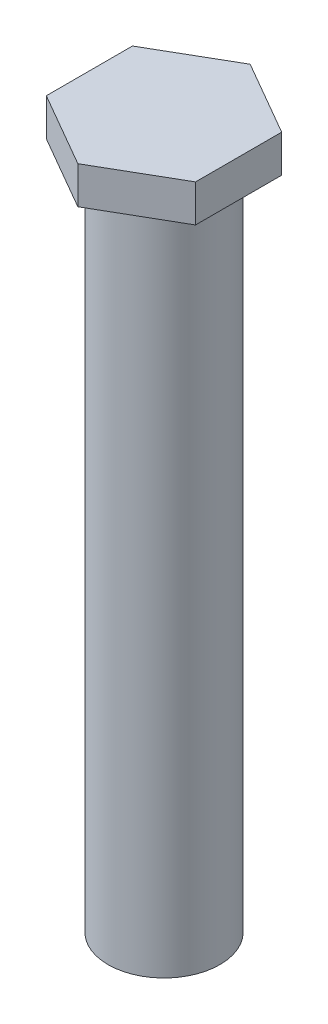
ISO-10303-21;
HEADER;
FILE_DESCRIPTION(('STEP AP214'),'2;1');
FILE_NAME('part.step','',(''),(''),'','','');
FILE_SCHEMA(('AUTOMOTIVE_DESIGN { 1 0 10303 214 1 1 1 1 }'));
ENDSEC;
DATA;
#1=APPLICATION_CONTEXT('core data for automotive mechanical design processes');
#2=APPLICATION_PROTOCOL_DEFINITION('international standard','automotive_design',2000,#1);
#3=PRODUCT_CONTEXT('',#1,'mechanical');
#4=PRODUCT('Part','Part','',(#3));
#5=PRODUCT_RELATED_PRODUCT_CATEGORY('part','',(#4));
#6=PRODUCT_DEFINITION_FORMATION('','',#4);
#7=PRODUCT_DEFINITION_CONTEXT('part definition',#1,'design');
#8=PRODUCT_DEFINITION('design','',#6,#7);
#9=PRODUCT_DEFINITION_SHAPE('','',#8);
#10=(LENGTH_UNIT() NAMED_UNIT(*) SI_UNIT(.MILLI.,.METRE.));
#11=(NAMED_UNIT(*) PLANE_ANGLE_UNIT() SI_UNIT($,.RADIAN.));
#12=(NAMED_UNIT(*) SI_UNIT($,.STERADIAN.) SOLID_ANGLE_UNIT());
#13=UNCERTAINTY_MEASURE_WITH_UNIT(LENGTH_MEASURE(1.E-05),#10,'distance_accuracy_value','');
#14=(GEOMETRIC_REPRESENTATION_CONTEXT(3) GLOBAL_UNCERTAINTY_ASSIGNED_CONTEXT((#13)) GLOBAL_UNIT_ASSIGNED_CONTEXT((#10,
#11,#12)) REPRESENTATION_CONTEXT('',''));
#15=CARTESIAN_POINT('',(0.,0.,0.));
#16=DIRECTION('',(0.,0.,1.));
#17=DIRECTION('',(1.,0.,0.));
#18=AXIS2_PLACEMENT_3D('',#15,#16,#17);
#19=CARTESIAN_POINT('',(0.,114.3,0.));
#20=DIRECTION('',(0.,-1.,0.));
#21=DIRECTION('',(0.,0.,-1.));
#22=AXIS2_PLACEMENT_3D('',#19,#20,#21);
#23=CYLINDRICAL_SURFACE('',#22,9.525);
#24=CARTESIAN_POINT('',(0.,114.3,0.));
#25=DIRECTION('',(0.,1.,0.));
#26=DIRECTION('',(0.,0.,1.));
#27=AXIS2_PLACEMENT_3D('',#24,#25,#26);
#28=CIRCLE('',#27,9.525);
#29=CARTESIAN_POINT('',(0.,114.3,9.525));
#30=VERTEX_POINT('',#29);
#31=EDGE_CURVE('E11',#30,#30,#28,.T.);
#32=ORIENTED_EDGE('',*,*,#31,.F.);
#33=EDGE_LOOP('',(#32));
#34=FACE_BOUND('',#33,.T.);
#35=CARTESIAN_POINT('',(0.,0.,0.));
#36=DIRECTION('',(0.,1.,0.));
#37=DIRECTION('',(0.,0.,1.));
#38=AXIS2_PLACEMENT_3D('',#35,#36,#37);
#39=CIRCLE('',#38,9.525);
#40=CARTESIAN_POINT('',(0.,0.,9.525));
#41=VERTEX_POINT('',#40);
#42=EDGE_CURVE('E35',#41,#41,#39,.T.);
#43=ORIENTED_EDGE('',*,*,#42,.T.);
#44=EDGE_LOOP('',(#43));
#45=FACE_BOUND('',#44,.T.);
#46=ADVANCED_FACE('F32',(#34,#45),#23,.T.);
#47=CARTESIAN_POINT('',(0.,0.,0.));
#48=DIRECTION('',(0.,1.,0.));
#49=DIRECTION('',(0.,0.,1.));
#50=AXIS2_PLACEMENT_3D('',#47,#48,#49);
#51=PLANE('',#50);
#52=ORIENTED_EDGE('',*,*,#42,.F.);
#53=EDGE_LOOP('',(#52));
#54=FACE_BOUND('',#53,.T.);
#55=ADVANCED_FACE('F140',(#54),#51,.F.);
#56=CARTESIAN_POINT('',(0.,114.3,0.));
#57=DIRECTION('',(0.,1.,0.));
#58=DIRECTION('',(0.,0.,1.));
#59=AXIS2_PLACEMENT_3D('',#56,#57,#58);
#60=PLANE('',#59);
#61=DIRECTION('',(0.,0.,-1.));
#62=VECTOR('',#61,1.);
#63=CARTESIAN_POINT('',(12.7,114.3,7.33234841870825));
#64=LINE('',#63,#62);
#65=CARTESIAN_POINT('',(12.7,114.3,7.33234841870825));
#66=VERTEX_POINT('',#65);
#67=CARTESIAN_POINT('',(12.7,114.3,-7.33234841870825));
#68=VERTEX_POINT('',#67);
#69=EDGE_CURVE('E117',#66,#68,#64,.T.);
#70=ORIENTED_EDGE('',*,*,#69,.F.);
#71=DIRECTION('',(0.866025403784439,0.,-0.5));
#72=VECTOR('',#71,1.);
#73=CARTESIAN_POINT('',(0.,114.3,14.6646968374165));
#74=LINE('',#73,#72);
#75=CARTESIAN_POINT('',(0.,114.3,14.6646968374165));
#76=VERTEX_POINT('',#75);
#77=EDGE_CURVE('E77',#76,#66,#74,.T.);
#78=ORIENTED_EDGE('',*,*,#77,.F.);
#79=DIRECTION('',(0.866025403784439,0.,0.5));
#80=VECTOR('',#79,1.);
#81=CARTESIAN_POINT('',(-12.7,114.3,7.33234841870824));
#82=LINE('',#81,#80);
#83=CARTESIAN_POINT('',(-12.7,114.3,7.33234841870824));
#84=VERTEX_POINT('',#83);
#85=EDGE_CURVE('E71',#84,#76,#82,.T.);
#86=ORIENTED_EDGE('',*,*,#85,.F.);
#87=DIRECTION('',(0.,0.,1.));
#88=VECTOR('',#87,1.);
#89=CARTESIAN_POINT('',(-12.7,114.3,-7.33234841870825));
#90=LINE('',#89,#88);
#91=CARTESIAN_POINT('',(-12.7,114.3,-7.33234841870825));
#92=VERTEX_POINT('',#91);
#93=EDGE_CURVE('E107',#92,#84,#90,.T.);
#94=ORIENTED_EDGE('',*,*,#93,.F.);
#95=DIRECTION('',(-0.866025403784439,0.,0.5));
#96=VECTOR('',#95,1.);
#97=CARTESIAN_POINT('',(0.,114.3,-14.6646968374165));
#98=LINE('',#97,#96);
#99=CARTESIAN_POINT('',(0.,114.3,-14.6646968374165));
#100=VERTEX_POINT('',#99);
#101=EDGE_CURVE('E122',#100,#92,#98,.T.);
#102=ORIENTED_EDGE('',*,*,#101,.F.);
#103=DIRECTION('',(-0.866025403784439,0.,-0.5));
#104=VECTOR('',#103,1.);
#105=CARTESIAN_POINT('',(12.7,114.3,-7.33234841870825));
#106=LINE('',#105,#104);
#107=EDGE_CURVE('E120',#68,#100,#106,.T.);
#108=ORIENTED_EDGE('',*,*,#107,.F.);
#109=EDGE_LOOP('',(#70,#78,#86,#94,#102,#108));
#110=FACE_BOUND('',#109,.T.);
#111=ORIENTED_EDGE('',*,*,#31,.T.);
#112=EDGE_LOOP('',(#111));
#113=FACE_BOUND('',#112,.T.);
#114=ADVANCED_FACE('F142',(#110,#113),#60,.F.);
#115=CARTESIAN_POINT('',(12.7,120.65,7.33234841870825));
#116=DIRECTION('',(-1.,0.,0.));
#117=DIRECTION('',(0.,0.,1.));
#118=AXIS2_PLACEMENT_3D('',#115,#116,#117);
#119=PLANE('',#118);
#120=ORIENTED_EDGE('',*,*,#69,.T.);
#121=DIRECTION('',(0.,-1.,0.));
#122=VECTOR('',#121,1.);
#123=CARTESIAN_POINT('',(12.7,120.65,-7.33234841870825));
#124=LINE('',#123,#122);
#125=CARTESIAN_POINT('',(12.7,120.65,-7.33234841870825));
#126=VERTEX_POINT('',#125);
#127=EDGE_CURVE('E134',#126,#68,#124,.T.);
#128=ORIENTED_EDGE('',*,*,#127,.F.);
#129=DIRECTION('',(0.,0.,-1.));
#130=VECTOR('',#129,1.);
#131=CARTESIAN_POINT('',(12.7,120.65,7.33234841870825));
#132=LINE('',#131,#130);
#133=CARTESIAN_POINT('',(12.7,120.65,7.33234841870825));
#134=VERTEX_POINT('',#133);
#135=EDGE_CURVE('E127',#134,#126,#132,.T.);
#136=ORIENTED_EDGE('',*,*,#135,.F.);
#137=DIRECTION('',(0.,-1.,0.));
#138=VECTOR('',#137,1.);
#139=CARTESIAN_POINT('',(12.7,120.65,7.33234841870825));
#140=LINE('',#139,#138);
#141=EDGE_CURVE('E113',#134,#66,#140,.T.);
#142=ORIENTED_EDGE('',*,*,#141,.T.);
#143=EDGE_LOOP('',(#120,#128,#136,#142));
#144=FACE_BOUND('',#143,.T.);
#145=ADVANCED_FACE('F147',(#144),#119,.F.);
#146=CARTESIAN_POINT('',(12.7,120.65,-7.33234841870825));
#147=DIRECTION('',(-0.5,0.,0.866025403784439));
#148=DIRECTION('',(0.866025403784439,0.,0.5));
#149=AXIS2_PLACEMENT_3D('',#146,#147,#148);
#150=PLANE('',#149);
#151=ORIENTED_EDGE('',*,*,#107,.T.);
#152=DIRECTION('',(0.,-1.,0.));
#153=VECTOR('',#152,1.);
#154=CARTESIAN_POINT('',(0.,120.65,-14.6646968374165));
#155=LINE('',#154,#153);
#156=CARTESIAN_POINT('',(0.,120.65,-14.6646968374165));
#157=VERTEX_POINT('',#156);
#158=EDGE_CURVE('E131',#157,#100,#155,.T.);
#159=ORIENTED_EDGE('',*,*,#158,.F.);
#160=DIRECTION('',(-0.866025403784439,0.,-0.5));
#161=VECTOR('',#160,1.);
#162=CARTESIAN_POINT('',(12.7,120.65,-7.33234841870825));
#163=LINE('',#162,#161);
#164=EDGE_CURVE('E86',#126,#157,#163,.T.);
#165=ORIENTED_EDGE('',*,*,#164,.F.);
#166=ORIENTED_EDGE('',*,*,#127,.T.);
#167=EDGE_LOOP('',(#151,#159,#165,#166));
#168=FACE_BOUND('',#167,.T.);
#169=ADVANCED_FACE('F154',(#168),#150,.F.);
#170=CARTESIAN_POINT('',(0.,120.65,-14.6646968374165));
#171=DIRECTION('',(0.5,0.,0.866025403784439));
#172=DIRECTION('',(0.866025403784439,0.,-0.5));
#173=AXIS2_PLACEMENT_3D('',#170,#171,#172);
#174=PLANE('',#173);
#175=ORIENTED_EDGE('',*,*,#101,.T.);
#176=DIRECTION('',(0.,-1.,0.));
#177=VECTOR('',#176,1.);
#178=CARTESIAN_POINT('',(-12.7,120.65,-7.33234841870825));
#179=LINE('',#178,#177);
#180=CARTESIAN_POINT('',(-12.7,120.65,-7.33234841870825));
#181=VERTEX_POINT('',#180);
#182=EDGE_CURVE('E108',#181,#92,#179,.T.);
#183=ORIENTED_EDGE('',*,*,#182,.F.);
#184=DIRECTION('',(-0.866025403784439,0.,0.5));
#185=VECTOR('',#184,1.);
#186=CARTESIAN_POINT('',(0.,120.65,-14.6646968374165));
#187=LINE('',#186,#185);
#188=EDGE_CURVE('E99',#157,#181,#187,.T.);
#189=ORIENTED_EDGE('',*,*,#188,.F.);
#190=ORIENTED_EDGE('',*,*,#158,.T.);
#191=EDGE_LOOP('',(#175,#183,#189,#190));
#192=FACE_BOUND('',#191,.T.);
#193=ADVANCED_FACE('F158',(#192),#174,.F.);
#194=CARTESIAN_POINT('',(-12.7,120.65,-7.33234841870825));
#195=DIRECTION('',(1.,0.,0.));
#196=DIRECTION('',(0.,0.,-1.));
#197=AXIS2_PLACEMENT_3D('',#194,#195,#196);
#198=PLANE('',#197);
#199=ORIENTED_EDGE('',*,*,#93,.T.);
#200=DIRECTION('',(0.,-1.,0.));
#201=VECTOR('',#200,1.);
#202=CARTESIAN_POINT('',(-12.7,120.65,7.33234841870824));
#203=LINE('',#202,#201);
#204=CARTESIAN_POINT('',(-12.7,120.65,7.33234841870824));
#205=VERTEX_POINT('',#204);
#206=EDGE_CURVE('E104',#205,#84,#203,.T.);
#207=ORIENTED_EDGE('',*,*,#206,.F.);
#208=DIRECTION('',(0.,0.,1.));
#209=VECTOR('',#208,1.);
#210=CARTESIAN_POINT('',(-12.7,120.65,-7.33234841870825));
#211=LINE('',#210,#209);
#212=EDGE_CURVE('E93',#181,#205,#211,.T.);
#213=ORIENTED_EDGE('',*,*,#212,.F.);
#214=ORIENTED_EDGE('',*,*,#182,.T.);
#215=EDGE_LOOP('',(#199,#207,#213,#214));
#216=FACE_BOUND('',#215,.T.);
#217=ADVANCED_FACE('F105',(#216),#198,.F.);
#218=CARTESIAN_POINT('',(-12.7,120.65,7.33234841870824));
#219=DIRECTION('',(0.5,0.,-0.866025403784439));
#220=DIRECTION('',(-0.866025403784439,0.,-0.5));
#221=AXIS2_PLACEMENT_3D('',#218,#219,#220);
#222=PLANE('',#221);
#223=ORIENTED_EDGE('',*,*,#85,.T.);
#224=DIRECTION('',(0.,-1.,0.));
#225=VECTOR('',#224,1.);
#226=CARTESIAN_POINT('',(0.,120.65,14.6646968374165));
#227=LINE('',#226,#225);
#228=CARTESIAN_POINT('',(0.,120.65,14.6646968374165));
#229=VERTEX_POINT('',#228);
#230=EDGE_CURVE('E109',#229,#76,#227,.T.);
#231=ORIENTED_EDGE('',*,*,#230,.F.);
#232=DIRECTION('',(0.866025403784439,0.,0.5));
#233=VECTOR('',#232,1.);
#234=CARTESIAN_POINT('',(-12.7,120.65,7.33234841870824));
#235=LINE('',#234,#233);
#236=EDGE_CURVE('E97',#205,#229,#235,.T.);
#237=ORIENTED_EDGE('',*,*,#236,.F.);
#238=ORIENTED_EDGE('',*,*,#206,.T.);
#239=EDGE_LOOP('',(#223,#231,#237,#238));
#240=FACE_BOUND('',#239,.T.);
#241=ADVANCED_FACE('F111',(#240),#222,.F.);
#242=CARTESIAN_POINT('',(0.,120.65,14.6646968374165));
#243=DIRECTION('',(-0.5,0.,-0.866025403784439));
#244=DIRECTION('',(-0.866025403784439,0.,0.5));
#245=AXIS2_PLACEMENT_3D('',#242,#243,#244);
#246=PLANE('',#245);
#247=ORIENTED_EDGE('',*,*,#77,.T.);
#248=ORIENTED_EDGE('',*,*,#141,.F.);
#249=DIRECTION('',(0.866025403784439,0.,-0.5));
#250=VECTOR('',#249,1.);
#251=CARTESIAN_POINT('',(0.,120.65,14.6646968374165));
#252=LINE('',#251,#250);
#253=EDGE_CURVE('E48',#229,#134,#252,.T.);
#254=ORIENTED_EDGE('',*,*,#253,.F.);
#255=ORIENTED_EDGE('',*,*,#230,.T.);
#256=EDGE_LOOP('',(#247,#248,#254,#255));
#257=FACE_BOUND('',#256,.T.);
#258=ADVANCED_FACE('F166',(#257),#246,.F.);
#259=CARTESIAN_POINT('',(0.,120.65,0.));
#260=DIRECTION('',(0.,1.,0.));
#261=DIRECTION('',(0.,0.,1.));
#262=AXIS2_PLACEMENT_3D('',#259,#260,#261);
#263=PLANE('',#262);
#264=ORIENTED_EDGE('',*,*,#135,.T.);
#265=ORIENTED_EDGE('',*,*,#164,.T.);
#266=ORIENTED_EDGE('',*,*,#188,.T.);
#267=ORIENTED_EDGE('',*,*,#212,.T.);
#268=ORIENTED_EDGE('',*,*,#236,.T.);
#269=ORIENTED_EDGE('',*,*,#253,.T.);
#270=EDGE_LOOP('',(#264,#265,#266,#267,#268,#269));
#271=FACE_BOUND('',#270,.T.);
#272=ADVANCED_FACE('F95',(#271),#263,.T.);
#273=CLOSED_SHELL('',(#46,#55,#114,#145,#169,#193,#217,#241,#258,#272));
#274=MANIFOLD_SOLID_BREP('B2',#273);
#275=ADVANCED_BREP_SHAPE_REPRESENTATION('',(#18,#274),#14);
#276=SHAPE_DEFINITION_REPRESENTATION(#9,#275);
ENDSEC;
END-ISO-10303-21;
